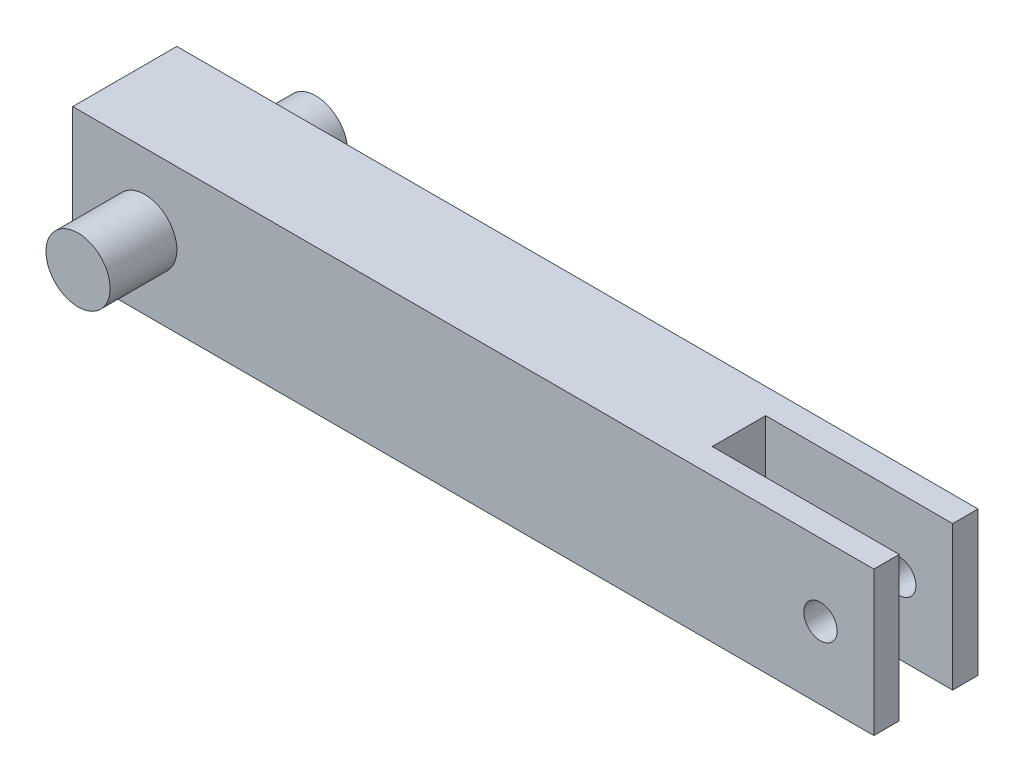
ISO-10303-21;
HEADER;
FILE_DESCRIPTION(('STEP AP214'),'2;1');
FILE_NAME('part.step','',(''),(''),'','','');
FILE_SCHEMA(('AUTOMOTIVE_DESIGN { 1 0 10303 214 1 1 1 1 }'));
ENDSEC;
DATA;
#1=APPLICATION_CONTEXT('core data for automotive mechanical design processes');
#2=APPLICATION_PROTOCOL_DEFINITION('international standard','automotive_design',2000,#1);
#3=PRODUCT_CONTEXT('',#1,'mechanical');
#4=PRODUCT('Part','Part','',(#3));
#5=PRODUCT_RELATED_PRODUCT_CATEGORY('part','',(#4));
#6=PRODUCT_DEFINITION_FORMATION('','',#4);
#7=PRODUCT_DEFINITION_CONTEXT('part definition',#1,'design');
#8=PRODUCT_DEFINITION('design','',#6,#7);
#9=PRODUCT_DEFINITION_SHAPE('','',#8);
#10=(LENGTH_UNIT() NAMED_UNIT(*) SI_UNIT(.MILLI.,.METRE.));
#11=(NAMED_UNIT(*) PLANE_ANGLE_UNIT() SI_UNIT($,.RADIAN.));
#12=(NAMED_UNIT(*) SI_UNIT($,.STERADIAN.) SOLID_ANGLE_UNIT());
#13=UNCERTAINTY_MEASURE_WITH_UNIT(LENGTH_MEASURE(1.E-05),#10,'distance_accuracy_value','');
#14=(GEOMETRIC_REPRESENTATION_CONTEXT(3) GLOBAL_UNCERTAINTY_ASSIGNED_CONTEXT((#13)) GLOBAL_UNIT_ASSIGNED_CONTEXT((#10,
#11,#12)) REPRESENTATION_CONTEXT('',''));
#15=CARTESIAN_POINT('',(0.,0.,0.));
#16=DIRECTION('',(0.,0.,1.));
#17=DIRECTION('',(1.,0.,0.));
#18=AXIS2_PLACEMENT_3D('',#15,#16,#17);
#19=CARTESIAN_POINT('',(300.,108.,-39.));
#20=DIRECTION('',(-1.,0.,0.));
#21=DIRECTION('',(0.,0.,1.));
#22=AXIS2_PLACEMENT_3D('',#19,#20,#21);
#23=PLANE('',#22);
#24=DIRECTION('',(0.,0.,-1.));
#25=VECTOR('',#24,1.);
#26=CARTESIAN_POINT('',(300.,108.,-39.));
#27=LINE('',#26,#25);
#28=CARTESIAN_POINT('',(300.,108.,-20.));
#29=VERTEX_POINT('',#28);
#30=CARTESIAN_POINT('',(300.,108.,-39.));
#31=VERTEX_POINT('',#30);
#32=EDGE_CURVE('E105',#29,#31,#27,.T.);
#33=ORIENTED_EDGE('',*,*,#32,.F.);
#34=DIRECTION('',(0.,-1.,0.));
#35=VECTOR('',#34,1.);
#36=CARTESIAN_POINT('',(300.,108.,-20.));
#37=LINE('',#36,#35);
#38=CARTESIAN_POINT('',(300.,0.,-20.));
#39=VERTEX_POINT('',#38);
#40=EDGE_CURVE('E215',#29,#39,#37,.T.);
#41=ORIENTED_EDGE('',*,*,#40,.T.);
#42=DIRECTION('',(0.,0.,-1.));
#43=VECTOR('',#42,1.);
#44=CARTESIAN_POINT('',(300.,0.,-39.));
#45=LINE('',#44,#43);
#46=CARTESIAN_POINT('',(300.,0.,-39.));
#47=VERTEX_POINT('',#46);
#48=EDGE_CURVE('E165',#39,#47,#45,.T.);
#49=ORIENTED_EDGE('',*,*,#48,.T.);
#50=DIRECTION('',(0.,-1.,0.));
#51=VECTOR('',#50,1.);
#52=CARTESIAN_POINT('',(300.,108.,-39.));
#53=LINE('',#52,#51);
#54=EDGE_CURVE('E182',#31,#47,#53,.T.);
#55=ORIENTED_EDGE('',*,*,#54,.F.);
#56=EDGE_LOOP('',(#33,#41,#49,#55));
#57=FACE_BOUND('',#56,.T.);
#58=ADVANCED_FACE('F51',(#57),#23,.F.);
#59=CARTESIAN_POINT('',(300.,0.,39.));
#60=VERTEX_POINT('',#59);
#61=CARTESIAN_POINT('',(300.,0.,20.));
#62=VERTEX_POINT('',#61);
#63=EDGE_CURVE('E141',#60,#62,#45,.T.);
#64=ORIENTED_EDGE('',*,*,#63,.T.);
#65=DIRECTION('',(0.,-1.,0.));
#66=VECTOR('',#65,1.);
#67=CARTESIAN_POINT('',(300.,108.,20.));
#68=LINE('',#67,#66);
#69=CARTESIAN_POINT('',(300.,108.,20.));
#70=VERTEX_POINT('',#69);
#71=EDGE_CURVE('E68',#70,#62,#68,.T.);
#72=ORIENTED_EDGE('',*,*,#71,.F.);
#73=CARTESIAN_POINT('',(300.,108.,39.));
#74=VERTEX_POINT('',#73);
#75=EDGE_CURVE('E139',#74,#70,#27,.T.);
#76=ORIENTED_EDGE('',*,*,#75,.F.);
#77=DIRECTION('',(0.,-1.,0.));
#78=VECTOR('',#77,1.);
#79=CARTESIAN_POINT('',(300.,108.,39.));
#80=LINE('',#79,#78);
#81=EDGE_CURVE('E161',#74,#60,#80,.T.);
#82=ORIENTED_EDGE('',*,*,#81,.T.);
#83=EDGE_LOOP('',(#64,#72,#76,#82));
#84=FACE_BOUND('',#83,.T.);
#85=ADVANCED_FACE('F53',(#84),#23,.F.);
#86=CARTESIAN_POINT('',(-300.,108.,-39.));
#87=DIRECTION('',(0.,0.,1.));
#88=DIRECTION('',(1.,0.,0.));
#89=AXIS2_PLACEMENT_3D('',#86,#87,#88);
#90=PLANE('',#89);
#91=CARTESIAN_POINT('',(260.,54.,-39.));
#92=DIRECTION('',(0.,0.,-1.));
#93=DIRECTION('',(-1.,0.,0.));
#94=AXIS2_PLACEMENT_3D('',#91,#92,#93);
#95=CIRCLE('',#94,12.5);
#96=CARTESIAN_POINT('',(247.5,54.,-39.));
#97=VERTEX_POINT('',#96);
#98=EDGE_CURVE('E299',#97,#97,#95,.T.);
#99=ORIENTED_EDGE('',*,*,#98,.F.);
#100=EDGE_LOOP('',(#99));
#101=FACE_BOUND('',#100,.T.);
#102=CARTESIAN_POINT('',(-246.,54.,-39.));
#103=DIRECTION('',(0.,0.,1.));
#104=DIRECTION('',(1.,0.,0.));
#105=AXIS2_PLACEMENT_3D('',#102,#103,#104);
#106=CIRCLE('',#105,24.);
#107=CARTESIAN_POINT('',(-222.,54.,-39.));
#108=VERTEX_POINT('',#107);
#109=EDGE_CURVE('E11',#108,#108,#106,.F.);
#110=ORIENTED_EDGE('',*,*,#109,.F.);
#111=EDGE_LOOP('',(#110));
#112=FACE_BOUND('',#111,.T.);
#113=DIRECTION('',(-1.,0.,0.));
#114=VECTOR('',#113,1.);
#115=CARTESIAN_POINT('',(-300.,0.,-39.));
#116=LINE('',#115,#114);
#117=CARTESIAN_POINT('',(-300.,0.,-39.));
#118=VERTEX_POINT('',#117);
#119=EDGE_CURVE('E164',#47,#118,#116,.T.);
#120=ORIENTED_EDGE('',*,*,#119,.T.);
#121=DIRECTION('',(0.,-1.,0.));
#122=VECTOR('',#121,1.);
#123=CARTESIAN_POINT('',(-300.,108.,-39.));
#124=LINE('',#123,#122);
#125=CARTESIAN_POINT('',(-300.,108.,-39.));
#126=VERTEX_POINT('',#125);
#127=EDGE_CURVE('E178',#126,#118,#124,.T.);
#128=ORIENTED_EDGE('',*,*,#127,.F.);
#129=DIRECTION('',(-1.,0.,0.));
#130=VECTOR('',#129,1.);
#131=CARTESIAN_POINT('',(-300.,108.,-39.));
#132=LINE('',#131,#130);
#133=EDGE_CURVE('E147',#31,#126,#132,.T.);
#134=ORIENTED_EDGE('',*,*,#133,.F.);
#135=ORIENTED_EDGE('',*,*,#54,.T.);
#136=EDGE_LOOP('',(#120,#128,#134,#135));
#137=FACE_BOUND('',#136,.T.);
#138=ADVANCED_FACE('F203',(#101,#112,#137),#90,.F.);
#139=CARTESIAN_POINT('',(-300.,108.,-39.));
#140=DIRECTION('',(1.,0.,0.));
#141=DIRECTION('',(0.,0.,-1.));
#142=AXIS2_PLACEMENT_3D('',#139,#140,#141);
#143=PLANE('',#142);
#144=DIRECTION('',(0.,0.,1.));
#145=VECTOR('',#144,1.);
#146=CARTESIAN_POINT('',(-300.,0.,-39.));
#147=LINE('',#146,#145);
#148=CARTESIAN_POINT('',(-300.,0.,39.));
#149=VERTEX_POINT('',#148);
#150=EDGE_CURVE('E168',#118,#149,#147,.T.);
#151=ORIENTED_EDGE('',*,*,#150,.T.);
#152=DIRECTION('',(0.,-1.,0.));
#153=VECTOR('',#152,1.);
#154=CARTESIAN_POINT('',(-300.,108.,39.));
#155=LINE('',#154,#153);
#156=CARTESIAN_POINT('',(-300.,108.,39.));
#157=VERTEX_POINT('',#156);
#158=EDGE_CURVE('E175',#157,#149,#155,.T.);
#159=ORIENTED_EDGE('',*,*,#158,.F.);
#160=DIRECTION('',(0.,0.,1.));
#161=VECTOR('',#160,1.);
#162=CARTESIAN_POINT('',(-300.,108.,-39.));
#163=LINE('',#162,#161);
#164=EDGE_CURVE('E151',#126,#157,#163,.T.);
#165=ORIENTED_EDGE('',*,*,#164,.F.);
#166=ORIENTED_EDGE('',*,*,#127,.T.);
#167=EDGE_LOOP('',(#151,#159,#165,#166));
#168=FACE_BOUND('',#167,.T.);
#169=ADVANCED_FACE('F194',(#168),#143,.F.);
#170=CARTESIAN_POINT('',(-300.,108.,39.));
#171=DIRECTION('',(0.,0.,-1.));
#172=DIRECTION('',(-1.,0.,0.));
#173=AXIS2_PLACEMENT_3D('',#170,#171,#172);
#174=PLANE('',#173);
#175=CARTESIAN_POINT('',(260.,54.,39.));
#176=DIRECTION('',(0.,0.,-1.));
#177=DIRECTION('',(-1.,0.,0.));
#178=AXIS2_PLACEMENT_3D('',#175,#176,#177);
#179=CIRCLE('',#178,12.5);
#180=CARTESIAN_POINT('',(247.5,54.,39.));
#181=VERTEX_POINT('',#180);
#182=EDGE_CURVE('E230',#181,#181,#179,.T.);
#183=ORIENTED_EDGE('',*,*,#182,.T.);
#184=EDGE_LOOP('',(#183));
#185=FACE_BOUND('',#184,.T.);
#186=CARTESIAN_POINT('',(-246.,54.,39.));
#187=DIRECTION('',(0.,0.,-1.));
#188=DIRECTION('',(-1.,0.,0.));
#189=AXIS2_PLACEMENT_3D('',#186,#187,#188);
#190=CIRCLE('',#189,24.);
#191=CARTESIAN_POINT('',(-270.,54.,39.));
#192=VERTEX_POINT('',#191);
#193=EDGE_CURVE('E61',#192,#192,#190,.F.);
#194=ORIENTED_EDGE('',*,*,#193,.F.);
#195=EDGE_LOOP('',(#194));
#196=FACE_BOUND('',#195,.T.);
#197=DIRECTION('',(1.,0.,0.));
#198=VECTOR('',#197,1.);
#199=CARTESIAN_POINT('',(-300.,0.,39.));
#200=LINE('',#199,#198);
#201=EDGE_CURVE('E98',#149,#60,#200,.T.);
#202=ORIENTED_EDGE('',*,*,#201,.T.);
#203=ORIENTED_EDGE('',*,*,#81,.F.);
#204=DIRECTION('',(1.,0.,0.));
#205=VECTOR('',#204,1.);
#206=CARTESIAN_POINT('',(-300.,108.,39.));
#207=LINE('',#206,#205);
#208=EDGE_CURVE('E77',#157,#74,#207,.T.);
#209=ORIENTED_EDGE('',*,*,#208,.F.);
#210=ORIENTED_EDGE('',*,*,#158,.T.);
#211=EDGE_LOOP('',(#202,#203,#209,#210));
#212=FACE_BOUND('',#211,.T.);
#213=ADVANCED_FACE('F192',(#185,#196,#212),#174,.F.);
#214=CARTESIAN_POINT('',(0.,108.,0.));
#215=DIRECTION('',(0.,1.,0.));
#216=DIRECTION('',(0.,0.,1.));
#217=AXIS2_PLACEMENT_3D('',#214,#215,#216);
#218=PLANE('',#217);
#219=DIRECTION('',(1.,0.,0.));
#220=VECTOR('',#219,1.);
#221=CARTESIAN_POINT('',(160.,108.,-20.));
#222=LINE('',#221,#220);
#223=CARTESIAN_POINT('',(160.,108.,-20.));
#224=VERTEX_POINT('',#223);
#225=EDGE_CURVE('E143',#224,#29,#222,.T.);
#226=ORIENTED_EDGE('',*,*,#225,.T.);
#227=ORIENTED_EDGE('',*,*,#32,.T.);
#228=ORIENTED_EDGE('',*,*,#133,.T.);
#229=ORIENTED_EDGE('',*,*,#164,.T.);
#230=ORIENTED_EDGE('',*,*,#208,.T.);
#231=ORIENTED_EDGE('',*,*,#75,.T.);
#232=DIRECTION('',(-1.,0.,0.));
#233=VECTOR('',#232,1.);
#234=CARTESIAN_POINT('',(160.,108.,20.));
#235=LINE('',#234,#233);
#236=CARTESIAN_POINT('',(160.,108.,20.));
#237=VERTEX_POINT('',#236);
#238=EDGE_CURVE('E127',#70,#237,#235,.T.);
#239=ORIENTED_EDGE('',*,*,#238,.T.);
#240=DIRECTION('',(0.,0.,-1.));
#241=VECTOR('',#240,1.);
#242=CARTESIAN_POINT('',(160.,108.,-20.));
#243=LINE('',#242,#241);
#244=EDGE_CURVE('E133',#237,#224,#243,.T.);
#245=ORIENTED_EDGE('',*,*,#244,.T.);
#246=EDGE_LOOP('',(#226,#227,#228,#229,#230,#231,#239,#245));
#247=FACE_BOUND('',#246,.T.);
#248=ADVANCED_FACE('F145',(#247),#218,.T.);
#249=CARTESIAN_POINT('',(0.,0.,0.));
#250=DIRECTION('',(0.,1.,0.));
#251=DIRECTION('',(0.,0.,1.));
#252=AXIS2_PLACEMENT_3D('',#249,#250,#251);
#253=PLANE('',#252);
#254=ORIENTED_EDGE('',*,*,#48,.F.);
#255=DIRECTION('',(1.,0.,0.));
#256=VECTOR('',#255,1.);
#257=CARTESIAN_POINT('',(160.,0.,-20.));
#258=LINE('',#257,#256);
#259=CARTESIAN_POINT('',(160.,0.,-20.));
#260=VERTEX_POINT('',#259);
#261=EDGE_CURVE('E134',#260,#39,#258,.T.);
#262=ORIENTED_EDGE('',*,*,#261,.F.);
#263=DIRECTION('',(0.,0.,-1.));
#264=VECTOR('',#263,1.);
#265=CARTESIAN_POINT('',(160.,0.,-20.));
#266=LINE('',#265,#264);
#267=CARTESIAN_POINT('',(160.,0.,20.));
#268=VERTEX_POINT('',#267);
#269=EDGE_CURVE('E228',#268,#260,#266,.T.);
#270=ORIENTED_EDGE('',*,*,#269,.F.);
#271=DIRECTION('',(-1.,0.,0.));
#272=VECTOR('',#271,1.);
#273=CARTESIAN_POINT('',(160.,0.,20.));
#274=LINE('',#273,#272);
#275=EDGE_CURVE('E225',#62,#268,#274,.T.);
#276=ORIENTED_EDGE('',*,*,#275,.F.);
#277=ORIENTED_EDGE('',*,*,#63,.F.);
#278=ORIENTED_EDGE('',*,*,#201,.F.);
#279=ORIENTED_EDGE('',*,*,#150,.F.);
#280=ORIENTED_EDGE('',*,*,#119,.F.);
#281=EDGE_LOOP('',(#254,#262,#270,#276,#277,#278,#279,#280));
#282=FACE_BOUND('',#281,.T.);
#283=ADVANCED_FACE('F201',(#282),#253,.F.);
#284=CARTESIAN_POINT('',(-246.,54.,89.));
#285=DIRECTION('',(0.,0.,-1.));
#286=DIRECTION('',(-1.,0.,0.));
#287=AXIS2_PLACEMENT_3D('',#284,#285,#286);
#288=CYLINDRICAL_SURFACE('',#287,24.);
#289=CARTESIAN_POINT('',(-246.,54.,89.));
#290=DIRECTION('',(0.,0.,1.));
#291=DIRECTION('',(1.,0.,0.));
#292=AXIS2_PLACEMENT_3D('',#289,#290,#291);
#293=CIRCLE('',#292,24.);
#294=CARTESIAN_POINT('',(-222.,54.,89.));
#295=VERTEX_POINT('',#294);
#296=EDGE_CURVE('E154',#295,#295,#293,.T.);
#297=ORIENTED_EDGE('',*,*,#296,.F.);
#298=EDGE_LOOP('',(#297));
#299=FACE_BOUND('',#298,.T.);
#300=ORIENTED_EDGE('',*,*,#193,.T.);
#301=EDGE_LOOP('',(#300));
#302=FACE_BOUND('',#301,.T.);
#303=ADVANCED_FACE('F190',(#299,#302),#288,.T.);
#304=CARTESIAN_POINT('',(-246.,54.,89.));
#305=DIRECTION('',(0.,0.,1.));
#306=DIRECTION('',(1.,0.,0.));
#307=AXIS2_PLACEMENT_3D('',#304,#305,#306);
#308=PLANE('',#307);
#309=ORIENTED_EDGE('',*,*,#296,.T.);
#310=EDGE_LOOP('',(#309));
#311=FACE_BOUND('',#310,.T.);
#312=ADVANCED_FACE('F258',(#311),#308,.T.);
#313=CARTESIAN_POINT('',(-246.,54.,-89.));
#314=DIRECTION('',(0.,0.,1.));
#315=DIRECTION('',(1.,0.,0.));
#316=AXIS2_PLACEMENT_3D('',#313,#314,#315);
#317=CYLINDRICAL_SURFACE('',#316,24.);
#318=CARTESIAN_POINT('',(-246.,54.,-89.));
#319=DIRECTION('',(0.,0.,-1.));
#320=DIRECTION('',(-1.,0.,0.));
#321=AXIS2_PLACEMENT_3D('',#318,#319,#320);
#322=CIRCLE('',#321,24.);
#323=CARTESIAN_POINT('',(-270.,54.,-89.));
#324=VERTEX_POINT('',#323);
#325=EDGE_CURVE('E244',#324,#324,#322,.T.);
#326=ORIENTED_EDGE('',*,*,#325,.F.);
#327=EDGE_LOOP('',(#326));
#328=FACE_BOUND('',#327,.T.);
#329=ORIENTED_EDGE('',*,*,#109,.T.);
#330=EDGE_LOOP('',(#329));
#331=FACE_BOUND('',#330,.T.);
#332=ADVANCED_FACE('F266',(#328,#331),#317,.T.);
#333=CARTESIAN_POINT('',(-246.,54.,-89.));
#334=DIRECTION('',(0.,0.,-1.));
#335=DIRECTION('',(-1.,0.,0.));
#336=AXIS2_PLACEMENT_3D('',#333,#334,#335);
#337=PLANE('',#336);
#338=ORIENTED_EDGE('',*,*,#325,.T.);
#339=EDGE_LOOP('',(#338));
#340=FACE_BOUND('',#339,.T.);
#341=ADVANCED_FACE('F271',(#340),#337,.T.);
#342=CARTESIAN_POINT('',(160.,108.,-20.));
#343=DIRECTION('',(0.,0.,-1.));
#344=DIRECTION('',(-1.,0.,0.));
#345=AXIS2_PLACEMENT_3D('',#342,#343,#344);
#346=PLANE('',#345);
#347=CARTESIAN_POINT('',(260.,54.,-20.));
#348=DIRECTION('',(0.,0.,-1.));
#349=DIRECTION('',(-1.,0.,0.));
#350=AXIS2_PLACEMENT_3D('',#347,#348,#349);
#351=CIRCLE('',#350,12.5);
#352=CARTESIAN_POINT('',(247.5,54.,-20.));
#353=VERTEX_POINT('',#352);
#354=EDGE_CURVE('E235',#353,#353,#351,.T.);
#355=ORIENTED_EDGE('',*,*,#354,.T.);
#356=EDGE_LOOP('',(#355));
#357=FACE_BOUND('',#356,.T.);
#358=ORIENTED_EDGE('',*,*,#261,.T.);
#359=ORIENTED_EDGE('',*,*,#40,.F.);
#360=ORIENTED_EDGE('',*,*,#225,.F.);
#361=DIRECTION('',(0.,-1.,0.));
#362=VECTOR('',#361,1.);
#363=CARTESIAN_POINT('',(160.,108.,-20.));
#364=LINE('',#363,#362);
#365=EDGE_CURVE('E245',#224,#260,#364,.T.);
#366=ORIENTED_EDGE('',*,*,#365,.T.);
#367=EDGE_LOOP('',(#358,#359,#360,#366));
#368=FACE_BOUND('',#367,.T.);
#369=ADVANCED_FACE('F275',(#357,#368),#346,.F.);
#370=CARTESIAN_POINT('',(160.,108.,-20.));
#371=DIRECTION('',(-1.,0.,0.));
#372=DIRECTION('',(0.,0.,1.));
#373=AXIS2_PLACEMENT_3D('',#370,#371,#372);
#374=PLANE('',#373);
#375=ORIENTED_EDGE('',*,*,#269,.T.);
#376=ORIENTED_EDGE('',*,*,#365,.F.);
#377=ORIENTED_EDGE('',*,*,#244,.F.);
#378=DIRECTION('',(0.,-1.,0.));
#379=VECTOR('',#378,1.);
#380=CARTESIAN_POINT('',(160.,108.,20.));
#381=LINE('',#380,#379);
#382=EDGE_CURVE('E129',#237,#268,#381,.T.);
#383=ORIENTED_EDGE('',*,*,#382,.T.);
#384=EDGE_LOOP('',(#375,#376,#377,#383));
#385=FACE_BOUND('',#384,.T.);
#386=ADVANCED_FACE('F279',(#385),#374,.F.);
#387=CARTESIAN_POINT('',(160.,108.,20.));
#388=DIRECTION('',(0.,0.,1.));
#389=DIRECTION('',(1.,0.,0.));
#390=AXIS2_PLACEMENT_3D('',#387,#388,#389);
#391=PLANE('',#390);
#392=CARTESIAN_POINT('',(260.,54.,20.));
#393=DIRECTION('',(0.,0.,1.));
#394=DIRECTION('',(1.,0.,0.));
#395=AXIS2_PLACEMENT_3D('',#392,#393,#394);
#396=CIRCLE('',#395,12.5);
#397=CARTESIAN_POINT('',(272.5,54.,20.));
#398=VERTEX_POINT('',#397);
#399=EDGE_CURVE('E55',#398,#398,#396,.T.);
#400=ORIENTED_EDGE('',*,*,#399,.T.);
#401=EDGE_LOOP('',(#400));
#402=FACE_BOUND('',#401,.T.);
#403=ORIENTED_EDGE('',*,*,#275,.T.);
#404=ORIENTED_EDGE('',*,*,#382,.F.);
#405=ORIENTED_EDGE('',*,*,#238,.F.);
#406=ORIENTED_EDGE('',*,*,#71,.T.);
#407=EDGE_LOOP('',(#403,#404,#405,#406));
#408=FACE_BOUND('',#407,.T.);
#409=ADVANCED_FACE('F128',(#402,#408),#391,.F.);
#410=CARTESIAN_POINT('',(260.,54.,89.));
#411=DIRECTION('',(0.,0.,-1.));
#412=DIRECTION('',(-1.,0.,0.));
#413=AXIS2_PLACEMENT_3D('',#410,#411,#412);
#414=CYLINDRICAL_SURFACE('',#413,12.5);
#415=ORIENTED_EDGE('',*,*,#399,.F.);
#416=EDGE_LOOP('',(#415));
#417=FACE_BOUND('',#416,.T.);
#418=ORIENTED_EDGE('',*,*,#182,.F.);
#419=EDGE_LOOP('',(#418));
#420=FACE_BOUND('',#419,.T.);
#421=ADVANCED_FACE('F278',(#417,#420),#414,.F.);
#422=ORIENTED_EDGE('',*,*,#98,.T.);
#423=EDGE_LOOP('',(#422));
#424=FACE_BOUND('',#423,.T.);
#425=ORIENTED_EDGE('',*,*,#354,.F.);
#426=EDGE_LOOP('',(#425));
#427=FACE_BOUND('',#426,.T.);
#428=ADVANCED_FACE('F288',(#424,#427),#414,.F.);
#429=CLOSED_SHELL('',(#58,#85,#138,#169,#213,#248,#283,#303,#312,#332,#341,#369,#386,#409,#421,#428));
#430=MANIFOLD_SOLID_BREP('B2',#429);
#431=ADVANCED_BREP_SHAPE_REPRESENTATION('',(#18,#430),#14);
#432=SHAPE_DEFINITION_REPRESENTATION(#9,#431);
ENDSEC;
END-ISO-10303-21;
